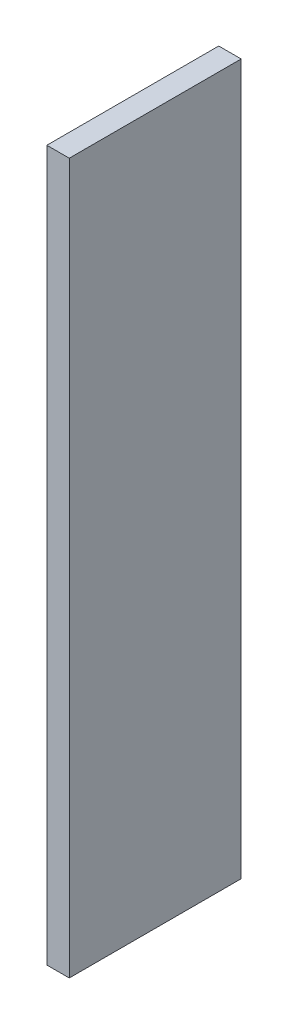
ISO-10303-21;
HEADER;
FILE_DESCRIPTION(('STEP AP214'),'2;1');
FILE_NAME('part.step','',(''),(''),'','','');
FILE_SCHEMA(('AUTOMOTIVE_DESIGN { 1 0 10303 214 1 1 1 1 }'));
ENDSEC;
DATA;
#1=APPLICATION_CONTEXT('core data for automotive mechanical design processes');
#2=APPLICATION_PROTOCOL_DEFINITION('international standard','automotive_design',2000,#1);
#3=PRODUCT_CONTEXT('',#1,'mechanical');
#4=PRODUCT('Part','Part','',(#3));
#5=PRODUCT_RELATED_PRODUCT_CATEGORY('part','',(#4));
#6=PRODUCT_DEFINITION_FORMATION('','',#4);
#7=PRODUCT_DEFINITION_CONTEXT('part definition',#1,'design');
#8=PRODUCT_DEFINITION('design','',#6,#7);
#9=PRODUCT_DEFINITION_SHAPE('','',#8);
#10=(LENGTH_UNIT() NAMED_UNIT(*) SI_UNIT(.MILLI.,.METRE.));
#11=(NAMED_UNIT(*) PLANE_ANGLE_UNIT() SI_UNIT($,.RADIAN.));
#12=(NAMED_UNIT(*) SI_UNIT($,.STERADIAN.) SOLID_ANGLE_UNIT());
#13=UNCERTAINTY_MEASURE_WITH_UNIT(LENGTH_MEASURE(1.E-05),#10,'distance_accuracy_value','');
#14=(GEOMETRIC_REPRESENTATION_CONTEXT(3) GLOBAL_UNCERTAINTY_ASSIGNED_CONTEXT((#13)) GLOBAL_UNIT_ASSIGNED_CONTEXT((#10,
#11,#12)) REPRESENTATION_CONTEXT('',''));
#15=CARTESIAN_POINT('',(0.,0.,0.));
#16=DIRECTION('',(0.,0.,1.));
#17=DIRECTION('',(1.,0.,0.));
#18=AXIS2_PLACEMENT_3D('',#15,#16,#17);
#19=CARTESIAN_POINT('',(76.1999999999999,4826.,-584.2));
#20=DIRECTION('',(-1.,0.,0.));
#21=DIRECTION('',(0.,0.,1.));
#22=AXIS2_PLACEMENT_3D('',#19,#20,#21);
#23=PLANE('',#22);
#24=DIRECTION('',(0.,0.,-1.));
#25=VECTOR('',#24,1.);
#26=CARTESIAN_POINT('',(76.1999999999999,0.,-584.2));
#27=LINE('',#26,#25);
#28=CARTESIAN_POINT('',(76.2000000000001,0.,584.2));
#29=VERTEX_POINT('',#28);
#30=CARTESIAN_POINT('',(76.1999999999999,0.,-584.2));
#31=VERTEX_POINT('',#30);
#32=EDGE_CURVE('E96',#29,#31,#27,.T.);
#33=ORIENTED_EDGE('',*,*,#32,.T.);
#34=DIRECTION('',(0.,-1.,0.));
#35=VECTOR('',#34,1.);
#36=CARTESIAN_POINT('',(76.1999999999999,4826.,-584.2));
#37=LINE('',#36,#35);
#38=CARTESIAN_POINT('',(76.1999999999999,4826.,-584.2));
#39=VERTEX_POINT('',#38);
#40=EDGE_CURVE('E11',#39,#31,#37,.T.);
#41=ORIENTED_EDGE('',*,*,#40,.F.);
#42=DIRECTION('',(0.,0.,-1.));
#43=VECTOR('',#42,1.);
#44=CARTESIAN_POINT('',(76.1999999999999,4826.,-584.2));
#45=LINE('',#44,#43);
#46=CARTESIAN_POINT('',(76.2000000000001,4826.,584.2));
#47=VERTEX_POINT('',#46);
#48=EDGE_CURVE('E84',#47,#39,#45,.T.);
#49=ORIENTED_EDGE('',*,*,#48,.F.);
#50=DIRECTION('',(0.,-1.,0.));
#51=VECTOR('',#50,1.);
#52=CARTESIAN_POINT('',(76.2000000000001,4826.,584.2));
#53=LINE('',#52,#51);
#54=EDGE_CURVE('E92',#47,#29,#53,.T.);
#55=ORIENTED_EDGE('',*,*,#54,.T.);
#56=EDGE_LOOP('',(#33,#41,#49,#55));
#57=FACE_BOUND('',#56,.T.);
#58=ADVANCED_FACE('F33',(#57),#23,.F.);
#59=CARTESIAN_POINT('',(-76.2000000000001,4826.,-584.2));
#60=DIRECTION('',(0.,0.,1.));
#61=DIRECTION('',(1.,0.,0.));
#62=AXIS2_PLACEMENT_3D('',#59,#60,#61);
#63=PLANE('',#62);
#64=DIRECTION('',(-1.,0.,0.));
#65=VECTOR('',#64,1.);
#66=CARTESIAN_POINT('',(-76.2000000000001,0.,-584.2));
#67=LINE('',#66,#65);
#68=CARTESIAN_POINT('',(-76.2000000000001,0.,-584.2));
#69=VERTEX_POINT('',#68);
#70=EDGE_CURVE('E88',#31,#69,#67,.T.);
#71=ORIENTED_EDGE('',*,*,#70,.T.);
#72=DIRECTION('',(0.,-1.,0.));
#73=VECTOR('',#72,1.);
#74=CARTESIAN_POINT('',(-76.2000000000001,4826.,-584.2));
#75=LINE('',#74,#73);
#76=CARTESIAN_POINT('',(-76.2000000000001,4826.,-584.2));
#77=VERTEX_POINT('',#76);
#78=EDGE_CURVE('E41',#77,#69,#75,.T.);
#79=ORIENTED_EDGE('',*,*,#78,.F.);
#80=DIRECTION('',(-1.,0.,0.));
#81=VECTOR('',#80,1.);
#82=CARTESIAN_POINT('',(-76.2000000000001,4826.,-584.2));
#83=LINE('',#82,#81);
#84=EDGE_CURVE('E79',#39,#77,#83,.T.);
#85=ORIENTED_EDGE('',*,*,#84,.F.);
#86=ORIENTED_EDGE('',*,*,#40,.T.);
#87=EDGE_LOOP('',(#71,#79,#85,#86));
#88=FACE_BOUND('',#87,.T.);
#89=ADVANCED_FACE('F87',(#88),#63,.F.);
#90=CARTESIAN_POINT('',(-76.2000000000001,4826.,-584.2));
#91=DIRECTION('',(1.,0.,0.));
#92=DIRECTION('',(0.,0.,-1.));
#93=AXIS2_PLACEMENT_3D('',#90,#91,#92);
#94=PLANE('',#93);
#95=DIRECTION('',(0.,0.,1.));
#96=VECTOR('',#95,1.);
#97=CARTESIAN_POINT('',(-76.2000000000001,0.,-584.2));
#98=LINE('',#97,#96);
#99=CARTESIAN_POINT('',(-76.1999999999999,0.,584.2));
#100=VERTEX_POINT('',#99);
#101=EDGE_CURVE('E66',#69,#100,#98,.T.);
#102=ORIENTED_EDGE('',*,*,#101,.T.);
#103=DIRECTION('',(0.,-1.,0.));
#104=VECTOR('',#103,1.);
#105=CARTESIAN_POINT('',(-76.1999999999999,4826.,584.2));
#106=LINE('',#105,#104);
#107=CARTESIAN_POINT('',(-76.1999999999999,4826.,584.2));
#108=VERTEX_POINT('',#107);
#109=EDGE_CURVE('E89',#108,#100,#106,.T.);
#110=ORIENTED_EDGE('',*,*,#109,.F.);
#111=DIRECTION('',(0.,0.,1.));
#112=VECTOR('',#111,1.);
#113=CARTESIAN_POINT('',(-76.2000000000001,4826.,-584.2));
#114=LINE('',#113,#112);
#115=EDGE_CURVE('E82',#77,#108,#114,.T.);
#116=ORIENTED_EDGE('',*,*,#115,.F.);
#117=ORIENTED_EDGE('',*,*,#78,.T.);
#118=EDGE_LOOP('',(#102,#110,#116,#117));
#119=FACE_BOUND('',#118,.T.);
#120=ADVANCED_FACE('F90',(#119),#94,.F.);
#121=CARTESIAN_POINT('',(-76.1999999999999,4826.,584.2));
#122=DIRECTION('',(0.,0.,-1.));
#123=DIRECTION('',(-1.,0.,0.));
#124=AXIS2_PLACEMENT_3D('',#121,#122,#123);
#125=PLANE('',#124);
#126=DIRECTION('',(1.,0.,0.));
#127=VECTOR('',#126,1.);
#128=CARTESIAN_POINT('',(-76.1999999999999,0.,584.2));
#129=LINE('',#128,#127);
#130=EDGE_CURVE('E72',#100,#29,#129,.T.);
#131=ORIENTED_EDGE('',*,*,#130,.T.);
#132=ORIENTED_EDGE('',*,*,#54,.F.);
#133=DIRECTION('',(1.,0.,0.));
#134=VECTOR('',#133,1.);
#135=CARTESIAN_POINT('',(-76.1999999999999,4826.,584.2));
#136=LINE('',#135,#134);
#137=EDGE_CURVE('E49',#108,#47,#136,.T.);
#138=ORIENTED_EDGE('',*,*,#137,.F.);
#139=ORIENTED_EDGE('',*,*,#109,.T.);
#140=EDGE_LOOP('',(#131,#132,#138,#139));
#141=FACE_BOUND('',#140,.T.);
#142=ADVANCED_FACE('F103',(#141),#125,.F.);
#143=CARTESIAN_POINT('',(0.,4826.,0.));
#144=DIRECTION('',(0.,1.,0.));
#145=DIRECTION('',(0.,0.,1.));
#146=AXIS2_PLACEMENT_3D('',#143,#144,#145);
#147=PLANE('',#146);
#148=ORIENTED_EDGE('',*,*,#48,.T.);
#149=ORIENTED_EDGE('',*,*,#84,.T.);
#150=ORIENTED_EDGE('',*,*,#115,.T.);
#151=ORIENTED_EDGE('',*,*,#137,.T.);
#152=EDGE_LOOP('',(#148,#149,#150,#151));
#153=FACE_BOUND('',#152,.T.);
#154=ADVANCED_FACE('F80',(#153),#147,.T.);
#155=CARTESIAN_POINT('',(0.,0.,0.));
#156=DIRECTION('',(0.,1.,0.));
#157=DIRECTION('',(0.,0.,1.));
#158=AXIS2_PLACEMENT_3D('',#155,#156,#157);
#159=PLANE('',#158);
#160=ORIENTED_EDGE('',*,*,#32,.F.);
#161=ORIENTED_EDGE('',*,*,#130,.F.);
#162=ORIENTED_EDGE('',*,*,#101,.F.);
#163=ORIENTED_EDGE('',*,*,#70,.F.);
#164=EDGE_LOOP('',(#160,#161,#162,#163));
#165=FACE_BOUND('',#164,.T.);
#166=ADVANCED_FACE('F106',(#165),#159,.F.);
#167=CLOSED_SHELL('',(#58,#89,#120,#142,#154,#166));
#168=MANIFOLD_SOLID_BREP('B2',#167);
#169=ADVANCED_BREP_SHAPE_REPRESENTATION('',(#18,#168),#14);
#170=SHAPE_DEFINITION_REPRESENTATION(#9,#169);
ENDSEC;
END-ISO-10303-21;
